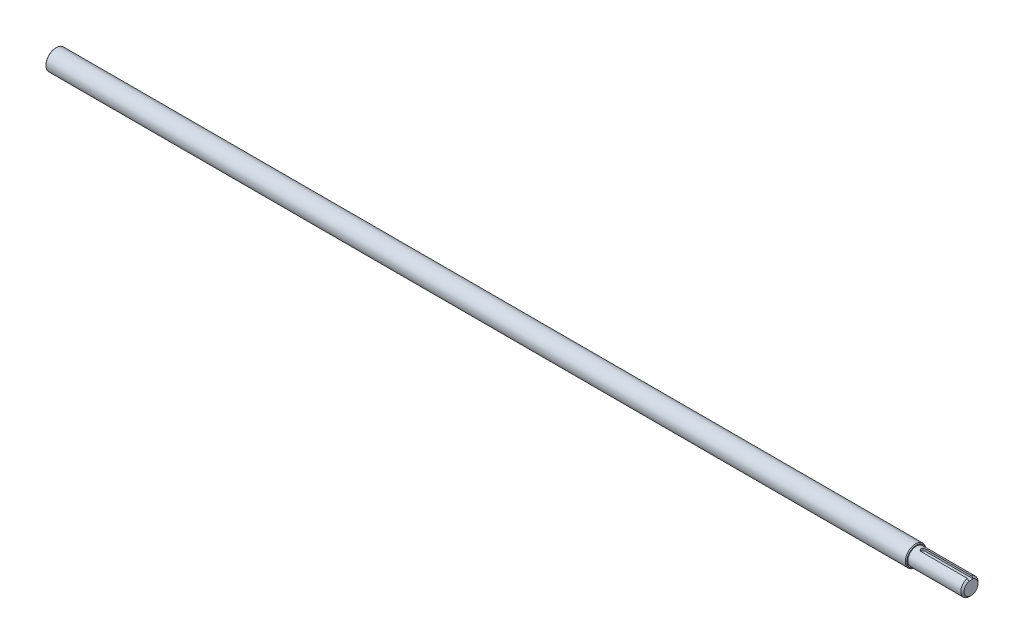
ISO-10303-21;
HEADER;
FILE_DESCRIPTION(('STEP AP214'),'2;1');
FILE_NAME('part.step','',(''),(''),'','','');
FILE_SCHEMA(('AUTOMOTIVE_DESIGN { 1 0 10303 214 1 1 1 1 }'));
ENDSEC;
DATA;
#1=APPLICATION_CONTEXT('core data for automotive mechanical design processes');
#2=APPLICATION_PROTOCOL_DEFINITION('international standard','automotive_design',2000,#1);
#3=PRODUCT_CONTEXT('',#1,'mechanical');
#4=PRODUCT('Part','Part','',(#3));
#5=PRODUCT_RELATED_PRODUCT_CATEGORY('part','',(#4));
#6=PRODUCT_DEFINITION_FORMATION('','',#4);
#7=PRODUCT_DEFINITION_CONTEXT('part definition',#1,'design');
#8=PRODUCT_DEFINITION('design','',#6,#7);
#9=PRODUCT_DEFINITION_SHAPE('','',#8);
#10=(LENGTH_UNIT() NAMED_UNIT(*) SI_UNIT(.MILLI.,.METRE.));
#11=(NAMED_UNIT(*) PLANE_ANGLE_UNIT() SI_UNIT($,.RADIAN.));
#12=(NAMED_UNIT(*) SI_UNIT($,.STERADIAN.) SOLID_ANGLE_UNIT());
#13=UNCERTAINTY_MEASURE_WITH_UNIT(LENGTH_MEASURE(1.E-05),#10,'distance_accuracy_value','');
#14=(GEOMETRIC_REPRESENTATION_CONTEXT(3) GLOBAL_UNCERTAINTY_ASSIGNED_CONTEXT((#13)) GLOBAL_UNIT_ASSIGNED_CONTEXT((#10,
#11,#12)) REPRESENTATION_CONTEXT('',''));
#15=CARTESIAN_POINT('',(0.,0.,0.));
#16=DIRECTION('',(0.,0.,1.));
#17=DIRECTION('',(1.,0.,0.));
#18=AXIS2_PLACEMENT_3D('',#15,#16,#17);
#19=CARTESIAN_POINT('',(304.8,0.,0.));
#20=DIRECTION('',(-1.,0.,0.));
#21=DIRECTION('',(0.,0.,1.));
#22=AXIS2_PLACEMENT_3D('',#19,#20,#21);
#23=CYLINDRICAL_SURFACE('',#22,4.7625);
#24=CARTESIAN_POINT('',(-304.55235,0.,0.));
#25=DIRECTION('',(1.,0.,0.));
#26=DIRECTION('',(0.,0.,-1.));
#27=AXIS2_PLACEMENT_3D('',#24,#25,#26);
#28=CIRCLE('',#27,4.7625);
#29=CARTESIAN_POINT('',(-304.55235,0.,4.7625));
#30=VERTEX_POINT('',#29);
#31=EDGE_CURVE('E169',#30,#30,#28,.T.);
#32=CARTESIAN_POINT('',(94.869,0.,0.));
#33=DIRECTION('',(-1.,0.,0.));
#34=DIRECTION('',(0.,0.,1.));
#35=AXIS2_PLACEMENT_3D('',#32,#33,#34);
#36=CIRCLE('',#35,4.7625);
#37=CARTESIAN_POINT('',(94.869,0.,4.7625));
#38=VERTEX_POINT('',#37);
#39=EDGE_CURVE('E196',#38,#38,#36,.T.);
#40=CARTESIAN_POINT('',(-304.55235,0.,4.7625));
#41=CARTESIAN_POINT('',(-300.3917109375,0.,4.7625));
#42=CARTESIAN_POINT('',(-296.231071875,0.,4.7625));
#43=CARTESIAN_POINT('',(-287.90979375,0.,4.7625));
#44=CARTESIAN_POINT('',(-283.7491546875,0.,4.7625));
#45=CARTESIAN_POINT('',(-275.4278765625,0.,4.7625));
#46=CARTESIAN_POINT('',(-271.2672375,0.,4.7625));
#47=CARTESIAN_POINT('',(-262.945959375,0.,4.7625));
#48=CARTESIAN_POINT('',(-258.7853203125,0.,4.7625));
#49=CARTESIAN_POINT('',(-250.4640421875,0.,4.7625));
#50=CARTESIAN_POINT('',(-246.303403125,0.,4.7625));
#51=CARTESIAN_POINT('',(-237.982125,0.,4.7625));
#52=CARTESIAN_POINT('',(-233.8214859375,0.,4.7625));
#53=CARTESIAN_POINT('',(-225.5002078125,0.,4.7625));
#54=CARTESIAN_POINT('',(-221.33956875,0.,4.7625));
#55=CARTESIAN_POINT('',(-213.018290625,0.,4.7625));
#56=CARTESIAN_POINT('',(-208.8576515625,0.,4.7625));
#57=CARTESIAN_POINT('',(-200.5363734375,0.,4.7625));
#58=CARTESIAN_POINT('',(-196.375734375,0.,4.7625));
#59=CARTESIAN_POINT('',(-188.05445625,0.,4.7625));
#60=CARTESIAN_POINT('',(-183.8938171875,0.,4.7625));
#61=CARTESIAN_POINT('',(-175.5725390625,0.,4.7625));
#62=CARTESIAN_POINT('',(-171.4119,0.,4.7625));
#63=CARTESIAN_POINT('',(-163.090621875,0.,4.7625));
#64=CARTESIAN_POINT('',(-158.9299828125,0.,4.7625));
#65=CARTESIAN_POINT('',(-150.6087046875,0.,4.7625));
#66=CARTESIAN_POINT('',(-146.448065625,0.,4.7625));
#67=CARTESIAN_POINT('',(-138.1267875,0.,4.7625));
#68=CARTESIAN_POINT('',(-133.9661484375,0.,4.7625));
#69=CARTESIAN_POINT('',(-125.6448703125,0.,4.7625));
#70=CARTESIAN_POINT('',(-121.48423125,0.,4.7625));
#71=CARTESIAN_POINT('',(-113.162953125,0.,4.7625));
#72=CARTESIAN_POINT('',(-109.0023140625,0.,4.7625));
#73=CARTESIAN_POINT('',(-100.6810359375,0.,4.7625));
#74=CARTESIAN_POINT('',(-96.5203968749998,0.,4.7625));
#75=CARTESIAN_POINT('',(-88.1991187499998,0.,4.7625));
#76=CARTESIAN_POINT('',(-84.0384796874998,0.,4.7625));
#77=CARTESIAN_POINT('',(-75.7172015624999,0.,4.7625));
#78=CARTESIAN_POINT('',(-71.5565624999999,0.,4.7625));
#79=CARTESIAN_POINT('',(-63.2352843749999,0.,4.7625));
#80=CARTESIAN_POINT('',(-59.0746453124999,0.,4.7625));
#81=CARTESIAN_POINT('',(-50.7533671874999,0.,4.7625));
#82=CARTESIAN_POINT('',(-46.5927281249999,0.,4.7625));
#83=CARTESIAN_POINT('',(-38.2714499999999,0.,4.7625));
#84=CARTESIAN_POINT('',(-34.1108109374999,0.,4.7625));
#85=CARTESIAN_POINT('',(-25.7895328124999,0.,4.7625));
#86=CARTESIAN_POINT('',(-21.6288937499999,0.,4.7625));
#87=CARTESIAN_POINT('',(-13.3076156249999,0.,4.7625));
#88=CARTESIAN_POINT('',(-9.14697656249993,0.,4.7625));
#89=CARTESIAN_POINT('',(-0.825698437499949,0.,4.7625));
#90=CARTESIAN_POINT('',(3.33494062500004,0.,4.7625));
#91=CARTESIAN_POINT('',(11.65621875,0.,4.7625));
#92=CARTESIAN_POINT('',(15.8168578125,0.,4.7625));
#93=CARTESIAN_POINT('',(24.1381359375,0.,4.7625));
#94=CARTESIAN_POINT('',(28.298775,0.,4.7625));
#95=CARTESIAN_POINT('',(36.620053125,0.,4.7625));
#96=CARTESIAN_POINT('',(40.7806921875,0.,4.7625));
#97=CARTESIAN_POINT('',(49.1019703125,0.,4.7625));
#98=CARTESIAN_POINT('',(53.262609375,0.,4.7625));
#99=CARTESIAN_POINT('',(61.5838875,0.,4.7625));
#100=CARTESIAN_POINT('',(65.7445265625,0.,4.7625));
#101=CARTESIAN_POINT('',(74.0658046875,0.,4.7625));
#102=CARTESIAN_POINT('',(78.22644375,0.,4.7625));
#103=CARTESIAN_POINT('',(86.547721875,0.,4.7625));
#104=CARTESIAN_POINT('',(90.7083609375,0.,4.7625));
#105=CARTESIAN_POINT('',(94.869,0.,4.7625));
#106=B_SPLINE_CURVE_WITH_KNOTS('',3,(#40,#41,#42,#43,#44,#45,#46,#47,#48,#49,#50,#51,#52,#53,
#54,#55,#56,#57,#58,#59,#60,#61,#62,#63,#64,#65,#66,#67,#68,#69,#70,#71,#72,#73,#74,#75,#76,#77,
#78,#79,#80,#81,#82,#83,#84,#85,#86,#87,#88,#89,#90,#91,#92,#93,#94,#95,#96,#97,#98,#99,#100,
#101,#102,#103,#104,#105),.UNSPECIFIED.,.F.,.F.,(4,2,2,2,2,2,2,2,2,2,2,2,2,2,2,2,2,2,2,2,2,2,2,
2,2,2,2,2,2,2,2,2,4),(0.,12.4819171875,24.9638343749999,37.4457515625,49.92766875,
62.4095859374999,74.8915031249999,87.3734203124999,99.8553375,112.3372546875,124.819171875,
137.3010890625,149.78300625,162.2649234375,174.746840625,187.2287578125,199.710675,
212.1925921875,224.674509375,237.1564265625,249.63834375,262.1202609375,274.602178125,
287.0840953125,299.5660125,312.0479296875,324.529846875,337.0117640625,349.49368125,
361.9755984375,374.457515625,386.9394328125,399.42135),.UNSPECIFIED.);
#107=EDGE_CURVE('BSEAM37',#30,#38,#106,.T.);
#108=ORIENTED_EDGE('',*,*,#31,.T.);
#109=ORIENTED_EDGE('',*,*,#39,.T.);
#110=ORIENTED_EDGE('',*,*,#107,.T.);
#111=ORIENTED_EDGE('',*,*,#107,.F.);
#112=EDGE_LOOP('',(#108,#110,#109,#111));
#113=FACE_BOUND('',#112,.T.);
#114=ADVANCED_FACE('F37',(#113),#23,.T.);
#115=CARTESIAN_POINT('',(-304.8,0.,0.));
#116=DIRECTION('',(1.,0.,0.));
#117=DIRECTION('',(0.,0.,-1.));
#118=AXIS2_PLACEMENT_3D('',#115,#116,#117);
#119=PLANE('',#118);
#120=CARTESIAN_POINT('',(-304.8,0.,0.));
#121=DIRECTION('',(1.,0.,0.));
#122=DIRECTION('',(0.,0.,-1.));
#123=AXIS2_PLACEMENT_3D('',#120,#121,#122);
#124=CIRCLE('',#123,4.51484999999963);
#125=CARTESIAN_POINT('',(-304.8,0.,-4.51484999999963));
#126=VERTEX_POINT('',#125);
#127=EDGE_CURVE('E157',#126,#126,#124,.F.);
#128=ORIENTED_EDGE('',*,*,#127,.T.);
#129=EDGE_LOOP('',(#128));
#130=FACE_BOUND('',#129,.T.);
#131=ADVANCED_FACE('F181',(#130),#119,.F.);
#132=CARTESIAN_POINT('',(-304.55235,0.,0.));
#133=DIRECTION('',(1.,0.,0.));
#134=DIRECTION('',(0.,0.,-1.));
#135=AXIS2_PLACEMENT_3D('',#132,#133,#134);
#136=CONICAL_SURFACE('',#135,4.7625,0.785398163397443);
#137=ORIENTED_EDGE('',*,*,#127,.F.);
#138=EDGE_LOOP('',(#137));
#139=FACE_BOUND('',#138,.T.);
#140=ORIENTED_EDGE('',*,*,#31,.F.);
#141=EDGE_LOOP('',(#140));
#142=FACE_BOUND('',#141,.T.);
#143=ADVANCED_FACE('F39',(#139,#142),#136,.T.);
#144=CARTESIAN_POINT('',(120.65,0.,0.));
#145=DIRECTION('',(1.,0.,0.));
#146=DIRECTION('',(0.,0.,-1.));
#147=AXIS2_PLACEMENT_3D('',#144,#145,#146);
#148=PLANE('',#147);
#149=DIRECTION('',(0.,1.,0.));
#150=VECTOR('',#149,1.);
#151=CARTESIAN_POINT('',(120.65,3.,1.));
#152=LINE('',#151,#150);
#153=CARTESIAN_POINT('',(120.65,3.,1.));
#154=VERTEX_POINT('',#153);
#155=CARTESIAN_POINT('',(120.65,3.07971492187185,1.));
#156=VERTEX_POINT('',#155);
#157=EDGE_CURVE('E120',#154,#156,#152,.T.);
#158=ORIENTED_EDGE('',*,*,#157,.T.);
#159=CARTESIAN_POINT('',(120.65,0.,0.));
#160=DIRECTION('',(-1.,0.,0.));
#161=DIRECTION('',(0.,0.,1.));
#162=AXIS2_PLACEMENT_3D('',#159,#160,#161);
#163=CIRCLE('',#162,3.23800000000002);
#164=CARTESIAN_POINT('',(120.65,3.07971492187185,-1.));
#165=VERTEX_POINT('',#164);
#166=EDGE_CURVE('E105',#165,#156,#163,.T.);
#167=ORIENTED_EDGE('',*,*,#166,.F.);
#168=DIRECTION('',(0.,1.,0.));
#169=VECTOR('',#168,1.);
#170=CARTESIAN_POINT('',(120.65,3.,-1.));
#171=LINE('',#170,#169);
#172=CARTESIAN_POINT('',(120.65,3.,-1.));
#173=VERTEX_POINT('',#172);
#174=EDGE_CURVE('E96',#173,#165,#171,.T.);
#175=ORIENTED_EDGE('',*,*,#174,.F.);
#176=DIRECTION('',(0.,0.,1.));
#177=VECTOR('',#176,1.);
#178=CARTESIAN_POINT('',(120.65,3.,0.));
#179=LINE('',#178,#177);
#180=EDGE_CURVE('E11',#173,#154,#179,.T.);
#181=ORIENTED_EDGE('',*,*,#180,.T.);
#182=EDGE_LOOP('',(#158,#167,#175,#181));
#183=FACE_BOUND('',#182,.T.);
#184=ADVANCED_FACE('F103',(#183),#148,.T.);
#185=CARTESIAN_POINT('',(119.888,0.,0.));
#186=DIRECTION('',(-1.,0.,0.));
#187=DIRECTION('',(0.,0.,1.));
#188=AXIS2_PLACEMENT_3D('',#185,#186,#187);
#189=CONICAL_SURFACE('',#188,4.,0.785398163397436);
#190=CARTESIAN_POINT('',(118.630563347655,5.16145717345613,1.));
#191=CARTESIAN_POINT('',(118.768230570829,5.02122135481513,1.));
#192=CARTESIAN_POINT('',(118.905802751814,4.88089193411207,1.));
#193=CARTESIAN_POINT('',(119.180679384658,4.59997070742856,1.));
#194=CARTESIAN_POINT('',(119.317983836064,4.45937890100478,1.));
#195=CARTESIAN_POINT('',(119.592225565051,4.17788009387002,1.));
#196=CARTESIAN_POINT('',(119.729162896431,4.03697314559705,1.));
#197=CARTESIAN_POINT('',(120.002571082268,3.75470291426596,1.));
#198=CARTESIAN_POINT('',(120.139041929657,3.61333962435685,1.));
#199=CARTESIAN_POINT('',(120.411354354564,3.32995563495626,1.));
#200=CARTESIAN_POINT('',(120.547195806227,3.18793481445014,1.));
#201=CARTESIAN_POINT('',(120.817923147538,2.90299252032721,1.));
#202=CARTESIAN_POINT('',(120.952809071415,2.76007107932313,1.));
#203=CARTESIAN_POINT('',(121.154040338342,2.54463839253688,1.));
#204=CARTESIAN_POINT('',(121.220940574061,2.47264576077933,1.));
#205=CARTESIAN_POINT('',(121.354261098148,2.32821908283969,1.));
#206=CARTESIAN_POINT('',(121.420681393436,2.25578504304928,1.));
#207=CARTESIAN_POINT('',(121.552913175525,2.11034572994825,1.));
#208=CARTESIAN_POINT('',(121.61872458749,2.03734038840426,1.));
#209=CARTESIAN_POINT('',(121.7495008335,1.89056958249993,1.));
#210=CARTESIAN_POINT('',(121.814465625037,1.81680408030242,1.));
#211=CARTESIAN_POINT('',(121.878888997444,1.74256334765486,1.));
#212=B_SPLINE_CURVE_WITH_KNOTS('',3,(#190,#191,#192,#193,#194,#195,#196,#197,#198,#199,#200,
#201,#202,#203,#204,#205,#206,#207,#208,#209,#210,#211),.UNSPECIFIED.,.F.,.F.,(4,2,2,2,2,2,2,2,
2,2,4),(0.,0.589546837636748,1.17909467227604,1.76855078992286,2.3580157985286,2.94759398755989,
3.53715094843832,3.83198349561057,4.12681178363609,4.42167583885723,4.71655464257675),.UNSPECIFIED.);
#213=CARTESIAN_POINT('',(119.888,3.87298334620742,1.));
#214=VERTEX_POINT('',#213);
#215=EDGE_CURVE('E119',#214,#156,#212,.T.);
#216=ORIENTED_EDGE('',*,*,#215,.F.);
#217=CARTESIAN_POINT('',(119.888,0.,0.));
#218=DIRECTION('',(-1.,0.,0.));
#219=DIRECTION('',(0.,0.,1.));
#220=AXIS2_PLACEMENT_3D('',#217,#218,#219);
#221=CIRCLE('',#220,4.);
#222=CARTESIAN_POINT('',(119.888,3.87298334620742,-1.));
#223=VERTEX_POINT('',#222);
#224=EDGE_CURVE('E165',#223,#214,#221,.T.);
#225=ORIENTED_EDGE('',*,*,#224,.F.);
#226=CARTESIAN_POINT('',(121.878888997444,1.74256334765486,-1.));
#227=CARTESIAN_POINT('',(121.81455281966,1.81670372579507,-1.));
#228=CARTESIAN_POINT('',(121.749676599637,1.89037009303456,-1.));
#229=CARTESIAN_POINT('',(121.61907945039,2.03694441369029,-1.));
#230=CARTESIAN_POINT('',(121.553358563478,2.10985240476842,-1.));
#231=CARTESIAN_POINT('',(121.421308988897,2.25509814196675,-1.));
#232=CARTESIAN_POINT('',(121.354980375838,2.32743595610997,-1.));
#233=CARTESIAN_POINT('',(121.221844017012,2.47167093937892,-1.));
#234=CARTESIAN_POINT('',(121.155036264355,2.54356810213839,-1.));
#235=CARTESIAN_POINT('',(120.95408318354,2.75871518669529,-1.));
#236=CARTESIAN_POINT('',(120.819383742584,2.90144725376854,-1.));
#237=CARTESIAN_POINT('',(120.549030342591,3.18601176164891,-1.));
#238=CARTESIAN_POINT('',(120.413376349382,3.32784416989852,-1.));
#239=CARTESIAN_POINT('',(120.141071141475,3.61123506631713,-1.));
#240=CARTESIAN_POINT('',(120.00441827662,3.75279196786614,-1.));
#241=CARTESIAN_POINT('',(119.730644205883,4.0354476381477,-1.));
#242=CARTESIAN_POINT('',(119.593523007087,4.17654641375036,-1.));
#243=CARTESIAN_POINT('',(119.318912266264,4.45842779957373,-1.));
#244=CARTESIAN_POINT('',(119.181422670117,4.59921035704438,-1.));
#245=CARTESIAN_POINT('',(118.906174922038,4.88051227689868,-1.));
#246=CARTESIAN_POINT('',(118.768416770563,5.02103163972887,-1.));
#247=CARTESIAN_POINT('',(118.630563347655,5.16145717345613,-1.));
#248=B_SPLINE_CURVE_WITH_KNOTS('',3,(#226,#227,#228,#229,#230,#231,#232,#233,#234,#235,#236,
#237,#238,#239,#240,#241,#242,#243,#244,#245,#246,#247),.UNSPECIFIED.,.F.,.F.,(4,2,2,2,2,2,2,2,
2,2,4),(0.,0.294480009402863,0.588945324072436,0.88337496003831,1.17780883976175,
1.76656865331495,2.35534965315464,2.94561178847261,3.53586503090332,4.12621034377535,
4.71655465412275),.UNSPECIFIED.);
#249=EDGE_CURVE('E52',#165,#223,#248,.T.);
#250=ORIENTED_EDGE('',*,*,#249,.F.);
#251=ORIENTED_EDGE('',*,*,#166,.T.);
#252=EDGE_LOOP('',(#216,#225,#250,#251));
#253=FACE_BOUND('',#252,.T.);
#254=ADVANCED_FACE('F127',(#253),#189,.T.);
#255=CARTESIAN_POINT('',(120.65,0.,0.));
#256=DIRECTION('',(-1.,0.,0.));
#257=DIRECTION('',(0.,0.,1.));
#258=AXIS2_PLACEMENT_3D('',#255,#256,#257);
#259=CYLINDRICAL_SURFACE('',#258,4.);
#260=CARTESIAN_POINT('',(98.425,3.87298334620742,-0.999999999999999));
#261=CARTESIAN_POINT('',(98.3973370148935,3.87298148580177,-1.00000033749611));
#262=CARTESIAN_POINT('',(98.3696877369818,3.87328009949471,-0.998851407375365));
#263=CARTESIAN_POINT('',(98.3145959646964,3.87445904774559,-0.994271295395754));
#264=CARTESIAN_POINT('',(98.2871534363129,3.87533928441687,-0.990840497572679));
#265=CARTESIAN_POINT('',(98.2055468267911,3.87881710972054,-0.977175239382527));
#266=CARTESIAN_POINT('',(98.1519435315178,3.88225203148809,-0.963567695172492));
#267=CARTESIAN_POINT('',(98.047875326218,3.89095422588003,-0.927798076247994));
#268=CARTESIAN_POINT('',(97.9974101217871,3.8962213263093,-0.905636805423834));
#269=CARTESIAN_POINT('',(97.9008885513527,3.90799134471939,-0.853415378025862));
#270=CARTESIAN_POINT('',(97.854833372109,3.91449459395647,-0.823353103356927));
#271=CARTESIAN_POINT('',(97.7674561180939,3.92816262398025,-0.755484471828062));
#272=CARTESIAN_POINT('',(97.7262451137545,3.93533791028916,-0.71753726878397));
#273=CARTESIAN_POINT('',(97.6506979105173,3.94945104396194,-0.635275780516223));
#274=CARTESIAN_POINT('',(97.616362810532,3.95638885322537,-0.590960479478822));
#275=CARTESIAN_POINT('',(97.5550889983813,3.96936182283248,-0.49645689940168));
#276=CARTESIAN_POINT('',(97.528260104016,3.9753830468173,-0.446195340334464));
#277=CARTESIAN_POINT('',(97.4834752658033,3.98572346250589,-0.34170259084291));
#278=CARTESIAN_POINT('',(97.4655175757002,3.99004298914701,-0.287472184083002));
#279=CARTESIAN_POINT('',(97.4393410072226,3.99641900005128,-0.177744108525153));
#280=CARTESIAN_POINT('',(97.4309323275772,3.99851952901301,-0.122294322002851));
#281=CARTESIAN_POINT('',(97.4234966284567,4.00037438150816,-0.0107327756816739));
#282=CARTESIAN_POINT('',(97.4244684298076,4.00012899993445,0.0453789000287112));
#283=CARTESIAN_POINT('',(97.4356299636854,3.99735237365736,0.155352492972101));
#284=CARTESIAN_POINT('',(97.4456146165995,3.99487198677361,0.209236701739859));
#285=CARTESIAN_POINT('',(97.4741886791827,3.98796330636496,0.314538711084345));
#286=CARTESIAN_POINT('',(97.4927784695686,3.98353492665556,0.365956402423993));
#287=CARTESIAN_POINT('',(97.5382012806706,3.97314997761798,0.465407286024543));
#288=CARTESIAN_POINT('',(97.5651073942328,3.96717993827555,0.51340562960225));
#289=CARTESIAN_POINT('',(97.6263431298335,3.95435945541919,0.604276631230015));
#290=CARTESIAN_POINT('',(97.6606738702532,3.94750887933198,0.647148515562291));
#291=CARTESIAN_POINT('',(97.7368789120813,3.93345566022865,0.727769389708491));
#292=CARTESIAN_POINT('',(97.7789316365398,3.92624850477686,0.765349103054125));
#293=CARTESIAN_POINT('',(97.8688298669277,3.91246168284006,0.832969575186234));
#294=CARTESIAN_POINT('',(97.9166769532835,3.90588218842993,0.863008270245059));
#295=CARTESIAN_POINT('',(98.0171455978237,3.89407813586325,0.914804709285961));
#296=CARTESIAN_POINT('',(98.0697914648961,3.88886106009137,0.936517017887271));
#297=CARTESIAN_POINT('',(98.1781169284183,3.88047058807055,0.97070235184983));
#298=CARTESIAN_POINT('',(98.2337918551498,3.87729413761435,0.983189189212132));
#299=CARTESIAN_POINT('',(98.3124573807589,3.87455290681524,0.993904635150937));
#300=CARTESIAN_POINT('',(98.3349197032132,3.8739652311086,0.996190790966708));
#301=CARTESIAN_POINT('',(98.3799177899093,3.87318062488975,0.999236757697394));
#302=CARTESIAN_POINT('',(98.4024533759553,3.87298306219461,0.999999038096046));
#303=CARTESIAN_POINT('',(98.425,3.87298334620742,1.));
#304=B_SPLINE_CURVE_WITH_KNOTS('',3,(#260,#261,#262,#263,#264,#265,#266,#267,#268,#269,#270,
#271,#272,#273,#274,#275,#276,#277,#278,#279,#280,#281,#282,#283,#284,#285,#286,#287,#288,#289,
#290,#291,#292,#293,#294,#295,#296,#297,#298,#299,#300,#301,#302,#303),.UNSPECIFIED.,.F.,.F.,(4,
2,2,2,2,2,2,2,2,2,2,2,2,2,2,2,2,2,2,2,2,4),(0.,0.0829365303397623,0.165859106084649,
0.331229963080322,0.496585282091503,0.66198497472676,0.830641897427987,0.999325753539204,
1.17036187098236,1.34136430732425,1.50890481515325,1.67642426256639,1.84022545479276,
2.00403389475838,2.16932509450376,2.33464120964329,2.50441429534541,2.67423379180967,
2.84496720161069,3.01544447539986,3.08315848722647,3.15076267731671),.UNSPECIFIED.);
#305=CARTESIAN_POINT('',(98.425,3.87298334620742,-0.999999999999999));
#306=VERTEX_POINT('',#305);
#307=CARTESIAN_POINT('',(98.425,3.87298334620742,1.));
#308=VERTEX_POINT('',#307);
#309=EDGE_CURVE('E150',#306,#308,#304,.T.);
#310=ORIENTED_EDGE('',*,*,#309,.F.);
#311=DIRECTION('',(-1.,0.,0.));
#312=VECTOR('',#311,1.);
#313=CARTESIAN_POINT('',(120.65,3.87298334620742,-1.));
#314=LINE('',#313,#312);
#315=EDGE_CURVE('E45',#223,#306,#314,.T.);
#316=ORIENTED_EDGE('',*,*,#315,.F.);
#317=ORIENTED_EDGE('',*,*,#224,.T.);
#318=DIRECTION('',(-1.,0.,0.));
#319=VECTOR('',#318,1.);
#320=CARTESIAN_POINT('',(120.65,3.87298334620742,1.));
#321=LINE('',#320,#319);
#322=EDGE_CURVE('E60',#308,#214,#321,.F.);
#323=ORIENTED_EDGE('',*,*,#322,.F.);
#324=EDGE_LOOP('',(#310,#316,#317,#323));
#325=FACE_BOUND('',#324,.T.);
#326=CARTESIAN_POINT('',(95.25,0.,0.));
#327=DIRECTION('',(-1.,0.,0.));
#328=DIRECTION('',(0.,0.,1.));
#329=AXIS2_PLACEMENT_3D('',#326,#327,#328);
#330=CIRCLE('',#329,4.);
#331=CARTESIAN_POINT('',(95.25,0.,4.));
#332=VERTEX_POINT('',#331);
#333=EDGE_CURVE('E167',#332,#332,#330,.T.);
#334=ORIENTED_EDGE('',*,*,#333,.F.);
#335=EDGE_LOOP('',(#334));
#336=FACE_BOUND('',#335,.T.);
#337=ADVANCED_FACE('F144',(#325,#336),#259,.T.);
#338=CARTESIAN_POINT('',(95.25,4.,0.));
#339=DIRECTION('',(1.,0.,0.));
#340=DIRECTION('',(0.,0.,-1.));
#341=AXIS2_PLACEMENT_3D('',#338,#339,#340);
#342=PLANE('',#341);
#343=ORIENTED_EDGE('',*,*,#333,.T.);
#344=EDGE_LOOP('',(#343));
#345=FACE_BOUND('',#344,.T.);
#346=CARTESIAN_POINT('',(95.25,0.,0.));
#347=DIRECTION('',(-1.,0.,0.));
#348=DIRECTION('',(0.,0.,1.));
#349=AXIS2_PLACEMENT_3D('',#346,#347,#348);
#350=CIRCLE('',#349,4.38149999999999);
#351=CARTESIAN_POINT('',(95.25,0.,4.38149999999999));
#352=VERTEX_POINT('',#351);
#353=EDGE_CURVE('E172',#352,#352,#350,.T.);
#354=ORIENTED_EDGE('',*,*,#353,.F.);
#355=EDGE_LOOP('',(#354));
#356=FACE_BOUND('',#355,.T.);
#357=ADVANCED_FACE('F141',(#345,#356),#342,.T.);
#358=CARTESIAN_POINT('',(94.869,0.,0.));
#359=DIRECTION('',(-1.,0.,0.));
#360=DIRECTION('',(0.,0.,1.));
#361=AXIS2_PLACEMENT_3D('',#358,#359,#360);
#362=CONICAL_SURFACE('',#361,4.7625,0.785398163397447);
#363=ORIENTED_EDGE('',*,*,#353,.T.);
#364=EDGE_LOOP('',(#363));
#365=FACE_BOUND('',#364,.T.);
#366=ORIENTED_EDGE('',*,*,#39,.F.);
#367=EDGE_LOOP('',(#366));
#368=FACE_BOUND('',#367,.T.);
#369=ADVANCED_FACE('F137',(#365,#368),#362,.T.);
#370=CARTESIAN_POINT('',(120.65,3.,1.));
#371=DIRECTION('',(0.,0.,1.));
#372=DIRECTION('',(1.,0.,0.));
#373=AXIS2_PLACEMENT_3D('',#370,#371,#372);
#374=PLANE('',#373);
#375=ORIENTED_EDGE('',*,*,#215,.T.);
#376=ORIENTED_EDGE('',*,*,#157,.F.);
#377=DIRECTION('',(1.,0.,0.));
#378=VECTOR('',#377,1.);
#379=CARTESIAN_POINT('',(120.65,3.,1.));
#380=LINE('',#379,#378);
#381=CARTESIAN_POINT('',(98.425,3.,1.));
#382=VERTEX_POINT('',#381);
#383=EDGE_CURVE('E91',#382,#154,#380,.T.);
#384=ORIENTED_EDGE('',*,*,#383,.F.);
#385=DIRECTION('',(0.,1.,0.));
#386=VECTOR('',#385,1.);
#387=CARTESIAN_POINT('',(98.425,3.,1.));
#388=LINE('',#387,#386);
#389=EDGE_CURVE('E107',#382,#308,#388,.T.);
#390=ORIENTED_EDGE('',*,*,#389,.T.);
#391=ORIENTED_EDGE('',*,*,#322,.T.);
#392=EDGE_LOOP('',(#375,#376,#384,#390,#391));
#393=FACE_BOUND('',#392,.T.);
#394=ADVANCED_FACE('F140',(#393),#374,.F.);
#395=CARTESIAN_POINT('',(98.425,3.,0.));
#396=DIRECTION('',(0.,1.,0.));
#397=DIRECTION('',(0.,0.,1.));
#398=AXIS2_PLACEMENT_3D('',#395,#396,#397);
#399=CYLINDRICAL_SURFACE('',#398,1.);
#400=DIRECTION('',(0.,1.,0.));
#401=VECTOR('',#400,1.);
#402=CARTESIAN_POINT('',(98.425,3.,-0.999999999999999));
#403=LINE('',#402,#401);
#404=CARTESIAN_POINT('',(98.425,3.,-0.999999999999999));
#405=VERTEX_POINT('',#404);
#406=EDGE_CURVE('E98',#405,#306,#403,.T.);
#407=ORIENTED_EDGE('',*,*,#406,.T.);
#408=ORIENTED_EDGE('',*,*,#309,.T.);
#409=ORIENTED_EDGE('',*,*,#389,.F.);
#410=CARTESIAN_POINT('',(98.425,3.,0.));
#411=DIRECTION('',(0.,1.,0.));
#412=DIRECTION('',(0.,0.,1.));
#413=AXIS2_PLACEMENT_3D('',#410,#411,#412);
#414=CIRCLE('',#413,1.);
#415=EDGE_CURVE('E100',#405,#382,#414,.T.);
#416=ORIENTED_EDGE('',*,*,#415,.F.);
#417=EDGE_LOOP('',(#407,#408,#409,#416));
#418=FACE_BOUND('',#417,.T.);
#419=ADVANCED_FACE('F135',(#418),#399,.F.);
#420=CARTESIAN_POINT('',(120.65,3.,-1.));
#421=DIRECTION('',(0.,0.,-1.));
#422=DIRECTION('',(-1.,0.,0.));
#423=AXIS2_PLACEMENT_3D('',#420,#421,#422);
#424=PLANE('',#423);
#425=ORIENTED_EDGE('',*,*,#249,.T.);
#426=ORIENTED_EDGE('',*,*,#315,.T.);
#427=ORIENTED_EDGE('',*,*,#406,.F.);
#428=DIRECTION('',(-1.,0.,0.));
#429=VECTOR('',#428,1.);
#430=CARTESIAN_POINT('',(120.65,3.,-1.));
#431=LINE('',#430,#429);
#432=EDGE_CURVE('E89',#173,#405,#431,.T.);
#433=ORIENTED_EDGE('',*,*,#432,.F.);
#434=ORIENTED_EDGE('',*,*,#174,.T.);
#435=EDGE_LOOP('',(#425,#426,#427,#433,#434));
#436=FACE_BOUND('',#435,.T.);
#437=ADVANCED_FACE('F95',(#436),#424,.F.);
#438=CARTESIAN_POINT('',(120.65,3.,0.));
#439=DIRECTION('',(0.,1.,0.));
#440=DIRECTION('',(0.,0.,1.));
#441=AXIS2_PLACEMENT_3D('',#438,#439,#440);
#442=PLANE('',#441);
#443=ORIENTED_EDGE('',*,*,#432,.T.);
#444=ORIENTED_EDGE('',*,*,#415,.T.);
#445=ORIENTED_EDGE('',*,*,#383,.T.);
#446=ORIENTED_EDGE('',*,*,#180,.F.);
#447=EDGE_LOOP('',(#443,#444,#445,#446));
#448=FACE_BOUND('',#447,.T.);
#449=ADVANCED_FACE('F87',(#448),#442,.T.);
#450=CLOSED_SHELL('',(#114,#131,#143,#184,#254,#337,#357,#369,#394,#419,#437,#449));
#451=MANIFOLD_SOLID_BREP('B2',#450);
#452=ADVANCED_BREP_SHAPE_REPRESENTATION('',(#18,#451),#14);
#453=SHAPE_DEFINITION_REPRESENTATION(#9,#452);
ENDSEC;
END-ISO-10303-21;
